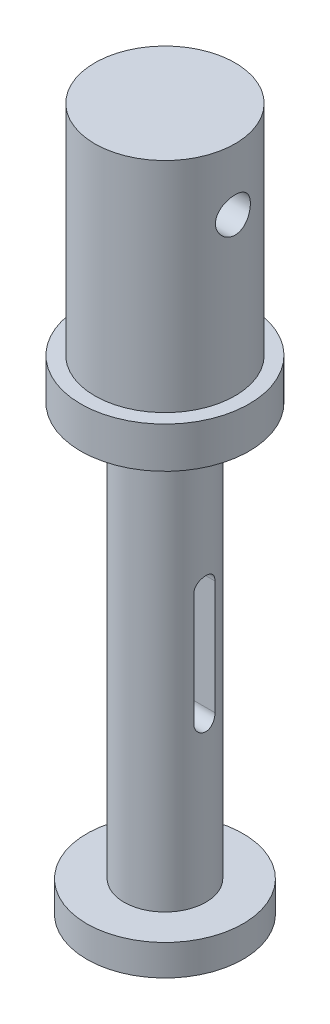
ISO-10303-21;
HEADER;
FILE_DESCRIPTION(('STEP AP214'),'2;1');
FILE_NAME('part.step','',(''),(''),'','','');
FILE_SCHEMA(('AUTOMOTIVE_DESIGN { 1 0 10303 214 1 1 1 1 }'));
ENDSEC;
DATA;
#1=APPLICATION_CONTEXT('core data for automotive mechanical design processes');
#2=APPLICATION_PROTOCOL_DEFINITION('international standard','automotive_design',2000,#1);
#3=PRODUCT_CONTEXT('',#1,'mechanical');
#4=PRODUCT('Part','Part','',(#3));
#5=PRODUCT_RELATED_PRODUCT_CATEGORY('part','',(#4));
#6=PRODUCT_DEFINITION_FORMATION('','',#4);
#7=PRODUCT_DEFINITION_CONTEXT('part definition',#1,'design');
#8=PRODUCT_DEFINITION('design','',#6,#7);
#9=PRODUCT_DEFINITION_SHAPE('','',#8);
#10=(LENGTH_UNIT() NAMED_UNIT(*) SI_UNIT(.MILLI.,.METRE.));
#11=(NAMED_UNIT(*) PLANE_ANGLE_UNIT() SI_UNIT($,.RADIAN.));
#12=(NAMED_UNIT(*) SI_UNIT($,.STERADIAN.) SOLID_ANGLE_UNIT());
#13=UNCERTAINTY_MEASURE_WITH_UNIT(LENGTH_MEASURE(1.E-05),#10,'distance_accuracy_value','');
#14=(GEOMETRIC_REPRESENTATION_CONTEXT(3) GLOBAL_UNCERTAINTY_ASSIGNED_CONTEXT((#13)) GLOBAL_UNIT_ASSIGNED_CONTEXT((#10,
#11,#12)) REPRESENTATION_CONTEXT('',''));
#15=CARTESIAN_POINT('',(0.,0.,0.));
#16=DIRECTION('',(0.,0.,1.));
#17=DIRECTION('',(1.,0.,0.));
#18=AXIS2_PLACEMENT_3D('',#15,#16,#17);
#19=CARTESIAN_POINT('',(0.,123.601449710491,0.));
#20=DIRECTION('',(0.,-1.,0.));
#21=DIRECTION('',(0.,0.,-1.));
#22=AXIS2_PLACEMENT_3D('',#19,#20,#21);
#23=PLANE('',#22);
#24=CARTESIAN_POINT('',(0.,123.601449710491,0.));
#25=DIRECTION('',(0.,1.,0.));
#26=DIRECTION('',(0.,0.,1.));
#27=AXIS2_PLACEMENT_3D('',#24,#25,#26);
#28=CIRCLE('',#27,12.);
#29=CARTESIAN_POINT('',(0.,123.601449710491,12.));
#30=VERTEX_POINT('',#29);
#31=EDGE_CURVE('E190',#30,#30,#28,.T.);
#32=ORIENTED_EDGE('',*,*,#31,.T.);
#33=EDGE_LOOP('',(#32));
#34=FACE_BOUND('',#33,.T.);
#35=ADVANCED_FACE('F41',(#34),#23,.F.);
#36=CARTESIAN_POINT('',(0.,123.601449710491,0.));
#37=DIRECTION('',(0.,1.,0.));
#38=DIRECTION('',(0.,0.,1.));
#39=AXIS2_PLACEMENT_3D('',#36,#37,#38);
#40=CYLINDRICAL_SURFACE('',#39,12.);
#41=CARTESIAN_POINT('',(-11.62231521736,113.066011559405,-2.98693638839584));
#42=CARTESIAN_POINT('',(-11.6223183801697,113.230975977914,-2.98693166113352));
#43=CARTESIAN_POINT('',(-11.6258657665658,113.395992864639,-2.97322370150407));
#44=CARTESIAN_POINT('',(-11.6396361609971,113.721289590537,-2.91884045516726));
#45=CARTESIAN_POINT('',(-11.6498630884159,113.881566590713,-2.87814933521781));
#46=CARTESIAN_POINT('',(-11.6757641628013,114.192631236569,-2.7711969454871));
#47=CARTESIAN_POINT('',(-11.6914313145505,114.343430776011,-2.70496850040691));
#48=CARTESIAN_POINT('',(-11.7264388481365,114.63179457068,-2.54892120584928));
#49=CARTESIAN_POINT('',(-11.7457793775798,114.76935829372,-2.45910140835074));
#50=CARTESIAN_POINT('',(-11.7864267900104,115.030346706336,-2.25632814220211));
#51=CARTESIAN_POINT('',(-11.8077648664083,115.153440084722,-2.14295441461951));
#52=CARTESIAN_POINT('',(-11.849732420939,115.379075489835,-1.8971968326496));
#53=CARTESIAN_POINT('',(-11.8703618331167,115.481615607948,-1.76481121473915));
#54=CARTESIAN_POINT('',(-11.908932604754,115.664587613319,-1.48251983846279));
#55=CARTESIAN_POINT('',(-11.9268328617315,115.744694276849,-1.33239717883652));
#56=CARTESIAN_POINT('',(-11.9575727088027,115.878411194022,-1.02029714033672));
#57=CARTESIAN_POINT('',(-11.9704130388202,115.932025322016,-0.858321498860026));
#58=CARTESIAN_POINT('',(-11.9893657617717,116.010174761936,-0.530567007805157));
#59=CARTESIAN_POINT('',(-11.9956081362523,116.035272627105,-0.364929938946551));
#60=CARTESIAN_POINT('',(-12.0011144589594,116.057442671495,-0.0316866184063519));
#61=CARTESIAN_POINT('',(-12.0003794303137,116.054518959645,0.13591934096827));
#62=CARTESIAN_POINT('',(-11.9921106172837,116.021133973194,0.464441964058615));
#63=CARTESIAN_POINT('',(-11.9847267486261,115.991279888804,0.625424672263459));
#64=CARTESIAN_POINT('',(-11.9641643332798,115.905857279361,0.940019658198392));
#65=CARTESIAN_POINT('',(-11.9509854796373,115.850287392163,1.09363154502619));
#66=CARTESIAN_POINT('',(-11.9200841141147,115.714517658872,1.39072725231274));
#67=CARTESIAN_POINT('',(-11.9023218802186,115.634101211777,1.53410778713243));
#68=CARTESIAN_POINT('',(-11.8641812610908,115.451085290987,1.80555214294636));
#69=CARTESIAN_POINT('',(-11.8438024244944,115.348481987959,1.93361331396632));
#70=CARTESIAN_POINT('',(-11.8020048211808,115.120748018583,2.17440462573014));
#71=CARTESIAN_POINT('',(-11.7805728230533,114.995086728508,2.28663115443474));
#72=CARTESIAN_POINT('',(-11.7395852424359,114.726503407052,2.48853005599463));
#73=CARTESIAN_POINT('',(-11.7200297461162,114.583580583691,2.57820139340809));
#74=CARTESIAN_POINT('',(-11.6849623655475,114.283549816758,2.73276317847063));
#75=CARTESIAN_POINT('',(-11.6694702183602,114.126377449681,2.79753335621964));
#76=CARTESIAN_POINT('',(-11.6445374489584,113.802896180227,2.89957525777056));
#77=CARTESIAN_POINT('',(-11.6350955445705,113.636589221779,2.93685280809036));
#78=CARTESIAN_POINT('',(-11.6236011435797,113.304227502764,2.98201773466639));
#79=CARTESIAN_POINT('',(-11.62136158423,113.138280222652,2.99064931213823));
#80=CARTESIAN_POINT('',(-11.6240164284782,112.807316213818,2.98031384687436));
#81=CARTESIAN_POINT('',(-11.6289101817135,112.64229940164,2.961349320148));
#82=CARTESIAN_POINT('',(-11.6451010889091,112.32063758392,2.89701226193752));
#83=CARTESIAN_POINT('',(-11.6562933127185,112.163900303304,2.85207214961408));
#84=CARTESIAN_POINT('',(-11.6837206409589,111.860183707112,2.73753863026177));
#85=CARTESIAN_POINT('',(-11.6999563387308,111.713205542119,2.66794232241214));
#86=CARTESIAN_POINT('',(-11.7360357417718,111.430023648297,2.5045113304102));
#87=CARTESIAN_POINT('',(-11.7559435260029,111.294085335074,2.41023121116154));
#88=CARTESIAN_POINT('',(-11.7969663615877,111.039685536874,2.20067280271578));
#89=CARTESIAN_POINT('',(-11.8180816091541,110.921226903602,2.0853910940746));
#90=CARTESIAN_POINT('',(-11.8597735516274,110.702139084867,1.83368828307186));
#91=CARTESIAN_POINT('',(-11.8803239358858,110.602024445422,1.69681413965957));
#92=CARTESIAN_POINT('',(-11.9180287495337,110.42620141213,1.40776465140332));
#93=CARTESIAN_POINT('',(-11.9351833556265,110.35049174821,1.25559010335636));
#94=CARTESIAN_POINT('',(-11.9640558964643,110.226282257308,0.941308814987651));
#95=CARTESIAN_POINT('',(-11.9758126974928,110.177587366222,0.779282906477346));
#96=CARTESIAN_POINT('',(-11.9927350310732,110.108203105836,0.449016649022797));
#97=CARTESIAN_POINT('',(-11.9979018238669,110.087508381872,0.280777494604103));
#98=CARTESIAN_POINT('',(-12.0010110594382,110.075010913081,-0.0523038423029869));
#99=CARTESIAN_POINT('',(-11.9991434600062,110.082448502218,-0.217116182064397));
#100=CARTESIAN_POINT('',(-11.988814471731,110.124266043411,-0.543064234666987));
#101=CARTESIAN_POINT('',(-11.9803532758811,110.158645206891,-0.704200054977051));
#102=CARTESIAN_POINT('',(-11.9578166298721,110.252964060413,-1.01743347128051));
#103=CARTESIAN_POINT('',(-11.9437711400986,110.312767463201,-1.16957440135236));
#104=CARTESIAN_POINT('',(-11.9115456613929,110.456113326475,-1.46174851933929));
#105=CARTESIAN_POINT('',(-11.8933651553181,110.539658756565,-1.60178018979349));
#106=CARTESIAN_POINT('',(-11.8542905190918,110.730439865792,-1.86936674640294));
#107=CARTESIAN_POINT('',(-11.8333421379864,110.838191674687,-1.99654572931224));
#108=CARTESIAN_POINT('',(-11.7913384473141,111.073323335266,-2.23127489828467));
#109=CARTESIAN_POINT('',(-11.7702831120398,111.200708145016,-2.33882011105886));
#110=CARTESIAN_POINT('',(-11.7300075169742,111.474319059691,-2.53317584492631));
#111=CARTESIAN_POINT('',(-11.7108282841015,111.620849437869,-2.61956717877612));
#112=CARTESIAN_POINT('',(-11.6770270952704,111.926810061673,-2.76636084615461));
#113=CARTESIAN_POINT('',(-11.6624018051404,112.086230761405,-2.82678220600074));
#114=CARTESIAN_POINT('',(-11.6416659101657,112.382159219783,-2.91085841664844));
#115=CARTESIAN_POINT('',(-11.634463762181,112.517243247058,-2.9393257539321));
#116=CARTESIAN_POINT('',(-11.6247872914603,112.790209967961,-2.9773659253434));
#117=CARTESIAN_POINT('',(-11.6223125730808,112.928092426409,-2.98694034064159));
#118=CARTESIAN_POINT('',(-11.62231521736,113.066011559405,-2.98693638839584));
#119=B_SPLINE_CURVE_WITH_KNOTS('',3,(#41,#42,#43,#44,#45,#46,#47,#48,#49,#50,#51,#52,#53,#54,
#55,#56,#57,#58,#59,#60,#61,#62,#63,#64,#65,#66,#67,#68,#69,#70,#71,#72,#73,#74,#75,#76,#77,#78,
#79,#80,#81,#82,#83,#84,#85,#86,#87,#88,#89,#90,#91,#92,#93,#94,#95,#96,#97,#98,#99,#100,#101,
#102,#103,#104,#105,#106,#107,#108,#109,#110,#111,#112,#113,#114,#115,#116,#117,#118),
.UNSPECIFIED.,.T.,.F.,(4,2,2,2,2,2,2,2,2,2,2,2,2,2,2,2,2,2,2,2,2,2,2,2,2,2,2,2,2,2,2,2,2,2,2,2,
2,2,4),(0.,0.494386812595482,0.989063979649592,1.48310741580161,1.9771707081819,
2.48095151216705,2.98477907655468,3.49557163041248,4.00628946226399,4.50674699328419,
5.00713114111596,5.49650776458021,5.98591031290087,6.47970573182357,6.97358644532842,
7.48072010939277,7.9878770502102,8.49745361970974,9.00692216349027,9.50304694941866,
9.99912650518059,10.4871763200128,10.9752835733676,11.4728919292681,11.9705813774673,
12.480603422528,12.9905989209861,13.4968623308568,14.0030289107953,14.4956261312873,
14.9882089341016,15.4781838838619,15.9682201456788,16.469909957104,16.9717266721743,
17.4828023834723,17.993503025766,18.4068716079686,18.8202055934075),.UNSPECIFIED.);
#120=CARTESIAN_POINT('',(-11.62231521736,113.066011559405,-2.98693638839584));
#121=VERTEX_POINT('',#120);
#122=EDGE_CURVE('E155',#121,#121,#119,.T.);
#123=ORIENTED_EDGE('',*,*,#122,.T.);
#124=EDGE_LOOP('',(#123));
#125=FACE_BOUND('',#124,.T.);
#126=CARTESIAN_POINT('',(11.62231521736,113.066011559405,-2.98693638839584));
#127=CARTESIAN_POINT('',(11.6223183801697,112.901047140896,-2.98693166113352));
#128=CARTESIAN_POINT('',(11.6258657665658,112.736030254171,-2.97322370150407));
#129=CARTESIAN_POINT('',(11.6396361609971,112.410733528273,-2.91884045516726));
#130=CARTESIAN_POINT('',(11.6498630884159,112.250456528096,-2.87814933521781));
#131=CARTESIAN_POINT('',(11.6757641628013,111.93939188224,-2.7711969454871));
#132=CARTESIAN_POINT('',(11.6914313145505,111.788592342798,-2.70496850040691));
#133=CARTESIAN_POINT('',(11.7264388481365,111.500228548129,-2.54892120584928));
#134=CARTESIAN_POINT('',(11.7457793775798,111.362664825089,-2.45910140835074));
#135=CARTESIAN_POINT('',(11.7864267900104,111.101676412474,-2.25632814220211));
#136=CARTESIAN_POINT('',(11.8077648664083,110.978583034088,-2.14295441461951));
#137=CARTESIAN_POINT('',(11.849732420939,110.752947628974,-1.8971968326496));
#138=CARTESIAN_POINT('',(11.8703618331167,110.650407510861,-1.76481121473915));
#139=CARTESIAN_POINT('',(11.908932604754,110.467435505491,-1.48251983846279));
#140=CARTESIAN_POINT('',(11.9268328617315,110.387328841961,-1.33239717883652));
#141=CARTESIAN_POINT('',(11.9575727088027,110.253611924787,-1.02029714033672));
#142=CARTESIAN_POINT('',(11.9704130388202,110.199997796793,-0.858321498860026));
#143=CARTESIAN_POINT('',(11.9893657617717,110.121848356873,-0.530567007805157));
#144=CARTESIAN_POINT('',(11.9956081362523,110.096750491704,-0.364929938946551));
#145=CARTESIAN_POINT('',(12.0011144589594,110.074580447314,-0.0316866184063515));
#146=CARTESIAN_POINT('',(12.0003794303137,110.077504159164,0.13591934096827));
#147=CARTESIAN_POINT('',(11.9921106172837,110.110889145615,0.464441964058616));
#148=CARTESIAN_POINT('',(11.9847267486261,110.140743230006,0.62542467226346));
#149=CARTESIAN_POINT('',(11.9641643332798,110.226165839449,0.940019658198393));
#150=CARTESIAN_POINT('',(11.9509854796373,110.281735726646,1.0936315450262));
#151=CARTESIAN_POINT('',(11.9200841141147,110.417505459937,1.39072725231274));
#152=CARTESIAN_POINT('',(11.9023218802186,110.497921907033,1.53410778713244));
#153=CARTESIAN_POINT('',(11.8641812610908,110.680937827823,1.80555214294636));
#154=CARTESIAN_POINT('',(11.8438024244944,110.78354113085,1.93361331396631));
#155=CARTESIAN_POINT('',(11.8020048211808,111.011275100226,2.17440462573015));
#156=CARTESIAN_POINT('',(11.7805728230533,111.136936390302,2.28663115443474));
#157=CARTESIAN_POINT('',(11.7395852424359,111.405519711758,2.48853005599464));
#158=CARTESIAN_POINT('',(11.7200297461162,111.548442535118,2.57820139340809));
#159=CARTESIAN_POINT('',(11.6849623655475,111.848473302052,2.73276317847063));
#160=CARTESIAN_POINT('',(11.6694702183602,112.005645669129,2.79753335621964));
#161=CARTESIAN_POINT('',(11.6445374489584,112.329126938582,2.89957525777056));
#162=CARTESIAN_POINT('',(11.6350955445705,112.495433897031,2.93685280809036));
#163=CARTESIAN_POINT('',(11.6236011435797,112.827795616045,2.98201773466639));
#164=CARTESIAN_POINT('',(11.62136158423,112.993742896157,2.99064931213823));
#165=CARTESIAN_POINT('',(11.6240164284782,113.324706904991,2.98031384687436));
#166=CARTESIAN_POINT('',(11.6289101817135,113.489723717169,2.961349320148));
#167=CARTESIAN_POINT('',(11.6451010889091,113.811385534889,2.89701226193752));
#168=CARTESIAN_POINT('',(11.6562933127185,113.968122815505,2.85207214961408));
#169=CARTESIAN_POINT('',(11.6837206409589,114.271839411698,2.73753863026177));
#170=CARTESIAN_POINT('',(11.6999563387308,114.41881757669,2.66794232241214));
#171=CARTESIAN_POINT('',(11.7360357417718,114.701999470513,2.5045113304102));
#172=CARTESIAN_POINT('',(11.7559435260029,114.837937783736,2.41023121116155));
#173=CARTESIAN_POINT('',(11.7969663615877,115.092337581936,2.20067280271579));
#174=CARTESIAN_POINT('',(11.8180816091541,115.210796215207,2.0853910940746));
#175=CARTESIAN_POINT('',(11.8597735516274,115.429884033943,1.83368828307186));
#176=CARTESIAN_POINT('',(11.8803239358858,115.529998673387,1.69681413965958));
#177=CARTESIAN_POINT('',(11.9180287495337,115.70582170668,1.40776465140332));
#178=CARTESIAN_POINT('',(11.9351833556265,115.781531370599,1.25559010335637));
#179=CARTESIAN_POINT('',(11.9640558964643,115.905740861501,0.941308814987652));
#180=CARTESIAN_POINT('',(11.9758126974928,115.954435752588,0.779282906477346));
#181=CARTESIAN_POINT('',(11.9927350310732,116.023820012974,0.449016649022797));
#182=CARTESIAN_POINT('',(11.9979018238669,116.044514736938,0.280777494604104));
#183=CARTESIAN_POINT('',(12.0010110594382,116.057012205729,-0.0523038423029864));
#184=CARTESIAN_POINT('',(11.9991434600062,116.049574616591,-0.217116182064396));
#185=CARTESIAN_POINT('',(11.988814471731,116.007757075399,-0.543064234666987));
#186=CARTESIAN_POINT('',(11.9803532758811,115.973377911918,-0.704200054977051));
#187=CARTESIAN_POINT('',(11.9578166298721,115.879059058397,-1.01743347128051));
#188=CARTESIAN_POINT('',(11.9437711400986,115.819255655608,-1.16957440135236));
#189=CARTESIAN_POINT('',(11.9115456613929,115.675909792334,-1.46174851933929));
#190=CARTESIAN_POINT('',(11.8933651553181,115.592364362245,-1.60178018979349));
#191=CARTESIAN_POINT('',(11.8542905190918,115.401583253017,-1.86936674640294));
#192=CARTESIAN_POINT('',(11.8333421379864,115.293831444122,-1.99654572931223));
#193=CARTESIAN_POINT('',(11.7913384473141,115.058699783543,-2.23127489828466));
#194=CARTESIAN_POINT('',(11.7702831120398,114.931314973794,-2.33882011105885));
#195=CARTESIAN_POINT('',(11.7300075169742,114.657704059119,-2.53317584492631));
#196=CARTESIAN_POINT('',(11.7108282841015,114.51117368094,-2.61956717877612));
#197=CARTESIAN_POINT('',(11.6770270952704,114.205213057137,-2.76636084615462));
#198=CARTESIAN_POINT('',(11.6624018051404,114.045792357404,-2.82678220600074));
#199=CARTESIAN_POINT('',(11.6416659101657,113.749863899027,-2.91085841664844));
#200=CARTESIAN_POINT('',(11.634463762181,113.614779871751,-2.9393257539321));
#201=CARTESIAN_POINT('',(11.6247872914603,113.341813150848,-2.9773659253434));
#202=CARTESIAN_POINT('',(11.6223125730808,113.203930692401,-2.98694034064159));
#203=CARTESIAN_POINT('',(11.62231521736,113.066011559405,-2.98693638839584));
#204=B_SPLINE_CURVE_WITH_KNOTS('',3,(#126,#127,#128,#129,#130,#131,#132,#133,#134,#135,#136,
#137,#138,#139,#140,#141,#142,#143,#144,#145,#146,#147,#148,#149,#150,#151,#152,#153,#154,#155,
#156,#157,#158,#159,#160,#161,#162,#163,#164,#165,#166,#167,#168,#169,#170,#171,#172,#173,#174,
#175,#176,#177,#178,#179,#180,#181,#182,#183,#184,#185,#186,#187,#188,#189,#190,#191,#192,#193,
#194,#195,#196,#197,#198,#199,#200,#201,#202,#203),.UNSPECIFIED.,.T.,.F.,(4,2,2,2,2,2,2,2,2,2,2,
2,2,2,2,2,2,2,2,2,2,2,2,2,2,2,2,2,2,2,2,2,2,2,2,2,2,2,4),(0.,0.494386812595482,
0.989063979649592,1.48310741580161,1.9771707081819,2.48095151216706,2.98477907655468,
3.49557163041248,4.00628946226399,4.50674699328419,5.00713114111596,5.49650776458022,
5.98591031290087,6.47970573182358,6.97358644532843,7.48072010939278,7.9878770502102,
8.49745361970974,9.00692216349027,9.50304694941866,9.99912650518059,10.4871763200128,
10.9752835733676,11.4728919292681,11.9705813774673,12.480603422528,12.9905989209861,
13.4968623308568,14.0030289107953,14.4956261312873,14.9882089341016,15.4781838838619,
15.9682201456788,16.469909957104,16.9717266721743,17.4828023834723,17.993503025766,
18.4068716079686,18.8202055934075),.UNSPECIFIED.);
#205=CARTESIAN_POINT('',(11.62231521736,113.066011559405,-2.98693638839584));
#206=VERTEX_POINT('',#205);
#207=EDGE_CURVE('E150',#206,#206,#204,.T.);
#208=ORIENTED_EDGE('',*,*,#207,.T.);
#209=EDGE_LOOP('',(#208));
#210=FACE_BOUND('',#209,.T.);
#211=ORIENTED_EDGE('',*,*,#31,.F.);
#212=EDGE_LOOP('',(#211));
#213=FACE_BOUND('',#212,.T.);
#214=CARTESIAN_POINT('',(0.,86.2616214612922,0.));
#215=DIRECTION('',(0.,1.,0.));
#216=DIRECTION('',(0.,0.,1.));
#217=AXIS2_PLACEMENT_3D('',#214,#215,#216);
#218=CIRCLE('',#217,12.);
#219=CARTESIAN_POINT('',(0.,86.2616214612922,12.));
#220=VERTEX_POINT('',#219);
#221=EDGE_CURVE('E192',#220,#220,#218,.T.);
#222=ORIENTED_EDGE('',*,*,#221,.T.);
#223=EDGE_LOOP('',(#222));
#224=FACE_BOUND('',#223,.T.);
#225=ADVANCED_FACE('F161',(#125,#210,#213,#224),#40,.T.);
#226=CARTESIAN_POINT('',(0.,86.2616214612921,-12.));
#227=DIRECTION('',(0.,-1.,0.));
#228=DIRECTION('',(0.,0.,-1.));
#229=AXIS2_PLACEMENT_3D('',#226,#227,#228);
#230=PLANE('',#229);
#231=ORIENTED_EDGE('',*,*,#221,.F.);
#232=EDGE_LOOP('',(#231));
#233=FACE_BOUND('',#232,.T.);
#234=CARTESIAN_POINT('',(0.,86.2616214612921,0.));
#235=DIRECTION('',(0.,1.,0.));
#236=DIRECTION('',(0.,0.,1.));
#237=AXIS2_PLACEMENT_3D('',#234,#235,#236);
#238=CIRCLE('',#237,14.3984122525992);
#239=CARTESIAN_POINT('',(0.,86.2616214612921,14.3984122525992));
#240=VERTEX_POINT('',#239);
#241=EDGE_CURVE('E194',#240,#240,#238,.T.);
#242=ORIENTED_EDGE('',*,*,#241,.T.);
#243=EDGE_LOOP('',(#242));
#244=FACE_BOUND('',#243,.T.);
#245=ADVANCED_FACE('F165',(#233,#244),#230,.F.);
#246=CARTESIAN_POINT('',(0.,123.601449710491,0.));
#247=DIRECTION('',(0.,1.,0.));
#248=DIRECTION('',(0.,0.,1.));
#249=AXIS2_PLACEMENT_3D('',#246,#247,#248);
#250=CYLINDRICAL_SURFACE('',#249,14.3984122525992);
#251=ORIENTED_EDGE('',*,*,#241,.F.);
#252=EDGE_LOOP('',(#251));
#253=FACE_BOUND('',#252,.T.);
#254=CARTESIAN_POINT('',(0.,79.2616214612922,0.));
#255=DIRECTION('',(0.,1.,0.));
#256=DIRECTION('',(0.,0.,1.));
#257=AXIS2_PLACEMENT_3D('',#254,#255,#256);
#258=CIRCLE('',#257,14.3984122525992);
#259=CARTESIAN_POINT('',(0.,79.2616214612922,14.3984122525992));
#260=VERTEX_POINT('',#259);
#261=EDGE_CURVE('E199',#260,#260,#258,.T.);
#262=ORIENTED_EDGE('',*,*,#261,.T.);
#263=EDGE_LOOP('',(#262));
#264=FACE_BOUND('',#263,.T.);
#265=ADVANCED_FACE('F170',(#253,#264),#250,.T.);
#266=CARTESIAN_POINT('',(0.,79.2616214612921,-6.99148112304805));
#267=DIRECTION('',(0.,1.,0.));
#268=DIRECTION('',(0.,0.,1.));
#269=AXIS2_PLACEMENT_3D('',#266,#267,#268);
#270=PLANE('',#269);
#271=ORIENTED_EDGE('',*,*,#261,.F.);
#272=EDGE_LOOP('',(#271));
#273=FACE_BOUND('',#272,.T.);
#274=CARTESIAN_POINT('',(0.,79.2616214612921,0.));
#275=DIRECTION('',(0.,1.,0.));
#276=DIRECTION('',(0.,0.,1.));
#277=AXIS2_PLACEMENT_3D('',#274,#275,#276);
#278=CIRCLE('',#277,6.99148112304804);
#279=CARTESIAN_POINT('',(0.,79.2616214612921,6.99148112304804));
#280=VERTEX_POINT('',#279);
#281=EDGE_CURVE('E202',#280,#280,#278,.T.);
#282=ORIENTED_EDGE('',*,*,#281,.T.);
#283=EDGE_LOOP('',(#282));
#284=FACE_BOUND('',#283,.T.);
#285=ADVANCED_FACE('F173',(#273,#284),#270,.F.);
#286=CARTESIAN_POINT('',(0.,123.601449710491,0.));
#287=DIRECTION('',(0.,1.,0.));
#288=DIRECTION('',(0.,0.,1.));
#289=AXIS2_PLACEMENT_3D('',#286,#287,#288);
#290=CYLINDRICAL_SURFACE('',#289,6.99148112304804);
#291=DIRECTION('',(0.,1.,0.));
#292=VECTOR('',#291,1.);
#293=CARTESIAN_POINT('',(6.75579812412546,123.601449710491,1.80000000000001));
#294=LINE('',#293,#292);
#295=CARTESIAN_POINT('',(6.75579812412545,35.8157884100073,1.8));
#296=VERTEX_POINT('',#295);
#297=CARTESIAN_POINT('',(6.75579812412546,55.3255499965933,1.8));
#298=VERTEX_POINT('',#297);
#299=EDGE_CURVE('E84',#296,#298,#294,.T.);
#300=ORIENTED_EDGE('',*,*,#299,.T.);
#301=CARTESIAN_POINT('',(6.75579812412546,55.3255499965933,1.8));
#302=CARTESIAN_POINT('',(6.75579465223751,55.3752915317262,1.80000066475597));
#303=CARTESIAN_POINT('',(6.75634817726223,55.4250083653446,1.79793683467152));
#304=CARTESIAN_POINT('',(6.75853339092846,55.5240691762918,1.78970994003612));
#305=CARTESIAN_POINT('',(6.76016488990851,55.5734132176661,1.78354759658672));
#306=CARTESIAN_POINT('',(6.76661028366605,55.7201397336168,1.75900444487241));
#307=CARTESIAN_POINT('',(6.77297549226203,55.8165122807149,1.73456710400741));
#308=CARTESIAN_POINT('',(6.78909825985746,56.003609215281,1.67033946178667));
#309=CARTESIAN_POINT('',(6.79885538199036,56.0943343283453,1.63055113751126));
#310=CARTESIAN_POINT('',(6.82065679321254,56.2678701964447,1.5368012711769));
#311=CARTESIAN_POINT('',(6.83270175793241,56.3506786026829,1.48283554053162));
#312=CARTESIAN_POINT('',(6.85803298576623,56.507905870848,1.36093248317618));
#313=CARTESIAN_POINT('',(6.87133992920604,56.5821132430406,1.29272674589587));
#314=CARTESIAN_POINT('',(6.89751790580934,56.7181777411845,1.1448513745644));
#315=CARTESIAN_POINT('',(6.91038886855768,56.7800328799524,1.06517989948772));
#316=CARTESIAN_POINT('',(6.93447495292805,56.8905077831596,0.895172158566369));
#317=CARTESIAN_POINT('',(6.94566264683084,56.9389173607929,0.804695089354983));
#318=CARTESIAN_POINT('',(6.96488301089709,57.0197568662734,0.616555307042727));
#319=CARTESIAN_POINT('',(6.97291632817667,57.0521900719996,0.518894072649977));
#320=CARTESIAN_POINT('',(6.98477645459233,57.0994748407784,0.321373788031119));
#321=CARTESIAN_POINT('',(6.98868965707985,57.1146880201288,0.221606583557543));
#322=CARTESIAN_POINT('',(6.9921701896188,57.1282372578362,0.0208622278241791));
#323=CARTESIAN_POINT('',(6.99173810403097,57.1265755855479,-0.0801147589180967));
#324=CARTESIAN_POINT('',(6.98664044030444,57.1066793238658,-0.277895852858275));
#325=CARTESIAN_POINT('',(6.98207470786089,57.0888355854125,-0.374742241938637));
#326=CARTESIAN_POINT('',(6.96933977393503,57.0377115539425,-0.564016051964715));
#327=CARTESIAN_POINT('',(6.96117040773468,57.0044305553024,-0.656443270701063));
#328=CARTESIAN_POINT('',(6.94199531781239,56.9230674652778,-0.83527280573364));
#329=CARTESIAN_POINT('',(6.93096350143285,56.8748483772301,-0.921609878746297));
#330=CARTESIAN_POINT('',(6.90725701655675,56.7650831473747,-1.08510038382327));
#331=CARTESIAN_POINT('',(6.89458208300257,56.7035348543046,-1.16225233033871));
#332=CARTESIAN_POINT('',(6.86853962304815,56.5667804800597,-1.30750855837715));
#333=CARTESIAN_POINT('',(6.85516265490853,56.4912345023478,-1.37529146343653));
#334=CARTESIAN_POINT('',(6.82954988269832,56.3296866934728,-1.49731640187323));
#335=CARTESIAN_POINT('',(6.81731439273287,56.2436819992519,-1.55155471497506));
#336=CARTESIAN_POINT('',(6.79533166468855,56.062984282681,-1.64517809861954));
#337=CARTESIAN_POINT('',(6.78559963455942,55.9682426977994,-1.6844730505908));
#338=CARTESIAN_POINT('',(6.76992212878296,55.7732412847546,-1.74642520565137));
#339=CARTESIAN_POINT('',(6.76397098339734,55.6729899653543,-1.76910732884709));
#340=CARTESIAN_POINT('',(6.75879122097401,55.5308085546176,-1.7887349835139));
#341=CARTESIAN_POINT('',(6.75767063780914,55.4898452145,-1.79295994635494));
#342=CARTESIAN_POINT('',(6.75617436706349,55.4077777988996,-1.79858935963434));
#343=CARTESIAN_POINT('',(6.75579748540338,55.3666740553371,-1.79999833144514));
#344=CARTESIAN_POINT('',(6.75579812412546,55.3255499965933,-1.8));
#345=B_SPLINE_CURVE_WITH_KNOTS('',3,(#301,#302,#303,#304,#305,#306,#307,#308,#309,#310,#311,
#312,#313,#314,#315,#316,#317,#318,#319,#320,#321,#322,#323,#324,#325,#326,#327,#328,#329,#330,
#331,#332,#333,#334,#335,#336,#337,#338,#339,#340,#341,#342,#343,#344),.UNSPECIFIED.,.F.,.F.,(4,
2,2,2,2,2,2,2,2,2,2,2,2,2,2,2,2,2,2,2,2,4),(0.,0.149130166823407,0.298234102292627,
0.595566532139844,0.892860680793426,1.19024276128026,1.49383954302066,1.79748512705682,
2.10563986911622,2.41373136057456,2.71522546545192,3.01667902550152,3.31103992282236,
3.60541427644233,3.90257251192043,4.19977874293736,4.50547416346649,4.81125345683503,
5.11884861725992,5.42598141863451,5.54948585603115,5.67279183412738),.UNSPECIFIED.);
#346=CARTESIAN_POINT('',(6.75579812412545,55.3255499965933,-1.8));
#347=VERTEX_POINT('',#346);
#348=EDGE_CURVE('E11',#298,#347,#345,.T.);
#349=ORIENTED_EDGE('',*,*,#348,.T.);
#350=DIRECTION('',(0.,1.,0.));
#351=VECTOR('',#350,1.);
#352=CARTESIAN_POINT('',(6.75579812412546,123.601449710491,-1.79999999999999));
#353=LINE('',#352,#351);
#354=CARTESIAN_POINT('',(6.75579812412546,35.8157884100073,-1.8));
#355=VERTEX_POINT('',#354);
#356=EDGE_CURVE('E54',#347,#355,#353,.F.);
#357=ORIENTED_EDGE('',*,*,#356,.T.);
#358=CARTESIAN_POINT('',(6.75579812412546,35.8157884100073,-1.8));
#359=CARTESIAN_POINT('',(6.75579465223751,35.7660468748744,-1.80000066475597));
#360=CARTESIAN_POINT('',(6.75634817726223,35.716330041256,-1.79793683467152));
#361=CARTESIAN_POINT('',(6.75853339092847,35.6172692303089,-1.78970994003612));
#362=CARTESIAN_POINT('',(6.76016488990852,35.5679251889345,-1.78354759658672));
#363=CARTESIAN_POINT('',(6.76661028366605,35.4211986729838,-1.75900444487241));
#364=CARTESIAN_POINT('',(6.77297549226203,35.3248261258857,-1.73456710400741));
#365=CARTESIAN_POINT('',(6.78909825985746,35.1377291913196,-1.67033946178667));
#366=CARTESIAN_POINT('',(6.79885538199036,35.0470040782553,-1.63055113751126));
#367=CARTESIAN_POINT('',(6.82065679321254,34.8734682101559,-1.53680127117691));
#368=CARTESIAN_POINT('',(6.83270175793241,34.7906598039177,-1.48283554053162));
#369=CARTESIAN_POINT('',(6.85803298576623,34.6334325357526,-1.36093248317618));
#370=CARTESIAN_POINT('',(6.87133992920604,34.5592251635601,-1.29272674589587));
#371=CARTESIAN_POINT('',(6.89751790580934,34.4231606654161,-1.1448513745644));
#372=CARTESIAN_POINT('',(6.91038886855768,34.3613055266483,-1.06517989948773));
#373=CARTESIAN_POINT('',(6.93447495292806,34.2508306234411,-0.89517215856637));
#374=CARTESIAN_POINT('',(6.94566264683085,34.2024210458077,-0.804695089354984));
#375=CARTESIAN_POINT('',(6.96488301089709,34.1215815403273,-0.616555307042728));
#376=CARTESIAN_POINT('',(6.97291632817667,34.0891483346011,-0.518894072649978));
#377=CARTESIAN_POINT('',(6.98477645459233,34.0418635658222,-0.321373788031119));
#378=CARTESIAN_POINT('',(6.98868965707985,34.0266503864719,-0.221606583557544));
#379=CARTESIAN_POINT('',(6.9921701896188,34.0131011487644,-0.020862227824179));
#380=CARTESIAN_POINT('',(6.99173810403097,34.0147628210528,0.080114758918097));
#381=CARTESIAN_POINT('',(6.98664044030443,34.0346590827348,0.277895852858275));
#382=CARTESIAN_POINT('',(6.98207470786089,34.0525028211881,0.374742241938638));
#383=CARTESIAN_POINT('',(6.96933977393503,34.1036268526582,0.564016051964715));
#384=CARTESIAN_POINT('',(6.96117040773468,34.1369078512983,0.656443270701063));
#385=CARTESIAN_POINT('',(6.94199531781239,34.2182709413228,0.83527280573364));
#386=CARTESIAN_POINT('',(6.93096350143285,34.2664900293706,0.921609878746298));
#387=CARTESIAN_POINT('',(6.90725701655674,34.376255259226,1.08510038382327));
#388=CARTESIAN_POINT('',(6.89458208300257,34.4378035522961,1.16225233033871));
#389=CARTESIAN_POINT('',(6.86853962304815,34.574557926541,1.30750855837714));
#390=CARTESIAN_POINT('',(6.85516265490853,34.6501039042529,1.37529146343653));
#391=CARTESIAN_POINT('',(6.82954988269832,34.8116517131279,1.49731640187322));
#392=CARTESIAN_POINT('',(6.81731439273286,34.8976564073488,1.55155471497506));
#393=CARTESIAN_POINT('',(6.79533166468855,35.0783541239197,1.64517809861954));
#394=CARTESIAN_POINT('',(6.78559963455942,35.1730957088013,1.6844730505908));
#395=CARTESIAN_POINT('',(6.76992212878296,35.3680971218461,1.74642520565137));
#396=CARTESIAN_POINT('',(6.76397098339734,35.4683484412464,1.76910732884709));
#397=CARTESIAN_POINT('',(6.758791220974,35.6105298519831,1.7887349835139));
#398=CARTESIAN_POINT('',(6.75767063780913,35.6514931921007,1.79295994635494));
#399=CARTESIAN_POINT('',(6.75617436706349,35.733560607701,1.79858935963434));
#400=CARTESIAN_POINT('',(6.75579748540337,35.7746643512635,1.79999833144514));
#401=CARTESIAN_POINT('',(6.75579812412546,35.8157884100073,1.8));
#402=B_SPLINE_CURVE_WITH_KNOTS('',3,(#358,#359,#360,#361,#362,#363,#364,#365,#366,#367,#368,
#369,#370,#371,#372,#373,#374,#375,#376,#377,#378,#379,#380,#381,#382,#383,#384,#385,#386,#387,
#388,#389,#390,#391,#392,#393,#394,#395,#396,#397,#398,#399,#400,#401),.UNSPECIFIED.,.F.,.F.,(4,
2,2,2,2,2,2,2,2,2,2,2,2,2,2,2,2,2,2,2,2,4),(0.,0.149130166823407,0.298234102292627,
0.595566532139844,0.892860680793426,1.19024276128026,1.49383954302065,1.79748512705682,
2.10563986911622,2.41373136057456,2.71522546545192,3.01667902550152,3.31103992282236,
3.60541427644233,3.90257251192043,4.19977874293736,4.50547416346649,4.81125345683503,
5.11884861725992,5.42598141863451,5.54948585603115,5.67279183412738),.UNSPECIFIED.);
#403=EDGE_CURVE('E88',#355,#296,#402,.T.);
#404=ORIENTED_EDGE('',*,*,#403,.T.);
#405=EDGE_LOOP('',(#300,#349,#357,#404));
#406=FACE_BOUND('',#405,.T.);
#407=DIRECTION('',(0.,1.,0.));
#408=VECTOR('',#407,1.);
#409=CARTESIAN_POINT('',(-6.75579812412546,123.601449710491,-1.79999999999999));
#410=LINE('',#409,#408);
#411=CARTESIAN_POINT('',(-6.75579812412546,35.8157884100073,-1.8));
#412=VERTEX_POINT('',#411);
#413=CARTESIAN_POINT('',(-6.75579812412546,55.3255499965933,-1.8));
#414=VERTEX_POINT('',#413);
#415=EDGE_CURVE('E126',#412,#414,#410,.T.);
#416=ORIENTED_EDGE('',*,*,#415,.T.);
#417=CARTESIAN_POINT('',(-6.75579812412546,55.3255499965933,-1.8));
#418=CARTESIAN_POINT('',(-6.75579465223751,55.3752915317262,-1.80000066475597));
#419=CARTESIAN_POINT('',(-6.75634817726223,55.4250083653446,-1.79793683467152));
#420=CARTESIAN_POINT('',(-6.75853339092847,55.5240691762918,-1.78970994003612));
#421=CARTESIAN_POINT('',(-6.76016488990852,55.5734132176661,-1.78354759658672));
#422=CARTESIAN_POINT('',(-6.76661028366605,55.7201397336168,-1.75900444487241));
#423=CARTESIAN_POINT('',(-6.77297549226203,55.8165122807149,-1.73456710400741));
#424=CARTESIAN_POINT('',(-6.78909825985746,56.003609215281,-1.67033946178667));
#425=CARTESIAN_POINT('',(-6.79885538199036,56.0943343283453,-1.63055113751126));
#426=CARTESIAN_POINT('',(-6.82065679321254,56.2678701964447,-1.5368012711769));
#427=CARTESIAN_POINT('',(-6.83270175793241,56.3506786026829,-1.48283554053162));
#428=CARTESIAN_POINT('',(-6.85803298576623,56.507905870848,-1.36093248317618));
#429=CARTESIAN_POINT('',(-6.87133992920604,56.5821132430406,-1.29272674589587));
#430=CARTESIAN_POINT('',(-6.89751790580934,56.7181777411845,-1.1448513745644));
#431=CARTESIAN_POINT('',(-6.91038886855768,56.7800328799524,-1.06517989948772));
#432=CARTESIAN_POINT('',(-6.93447495292806,56.8905077831596,-0.895172158566369));
#433=CARTESIAN_POINT('',(-6.94566264683085,56.9389173607929,-0.804695089354983));
#434=CARTESIAN_POINT('',(-6.96488301089709,57.0197568662734,-0.616555307042727));
#435=CARTESIAN_POINT('',(-6.97291632817667,57.0521900719996,-0.518894072649977));
#436=CARTESIAN_POINT('',(-6.98477645459233,57.0994748407784,-0.321373788031118));
#437=CARTESIAN_POINT('',(-6.98868965707985,57.1146880201288,-0.221606583557542));
#438=CARTESIAN_POINT('',(-6.9921701896188,57.1282372578362,-0.0208622278241781));
#439=CARTESIAN_POINT('',(-6.99173810403097,57.1265755855479,0.0801147589180978));
#440=CARTESIAN_POINT('',(-6.98664044030443,57.1066793238658,0.277895852858276));
#441=CARTESIAN_POINT('',(-6.98207470786089,57.0888355854125,0.374742241938638));
#442=CARTESIAN_POINT('',(-6.96933977393503,57.0377115539425,0.564016051964715));
#443=CARTESIAN_POINT('',(-6.96117040773468,57.0044305553024,0.656443270701063));
#444=CARTESIAN_POINT('',(-6.94199531781239,56.9230674652778,0.83527280573364));
#445=CARTESIAN_POINT('',(-6.93096350143285,56.8748483772301,0.921609878746298));
#446=CARTESIAN_POINT('',(-6.90725701655674,56.7650831473747,1.08510038382327));
#447=CARTESIAN_POINT('',(-6.89458208300257,56.7035348543046,1.16225233033871));
#448=CARTESIAN_POINT('',(-6.86853962304815,56.5667804800597,1.30750855837714));
#449=CARTESIAN_POINT('',(-6.85516265490853,56.4912345023478,1.37529146343653));
#450=CARTESIAN_POINT('',(-6.82954988269832,56.3296866934728,1.49731640187322));
#451=CARTESIAN_POINT('',(-6.81731439273286,56.2436819992519,1.55155471497506));
#452=CARTESIAN_POINT('',(-6.79533166468855,56.062984282681,1.64517809861953));
#453=CARTESIAN_POINT('',(-6.78559963455942,55.9682426977994,1.6844730505908));
#454=CARTESIAN_POINT('',(-6.76992212878296,55.7732412847546,1.74642520565137));
#455=CARTESIAN_POINT('',(-6.76397098339734,55.6729899653543,1.76910732884709));
#456=CARTESIAN_POINT('',(-6.758791220974,55.5308085546176,1.78873498351389));
#457=CARTESIAN_POINT('',(-6.75767063780913,55.4898452145,1.79295994635494));
#458=CARTESIAN_POINT('',(-6.75617436706349,55.4077777988996,1.79858935963434));
#459=CARTESIAN_POINT('',(-6.75579748540337,55.3666740553371,1.79999833144514));
#460=CARTESIAN_POINT('',(-6.75579812412546,55.3255499965933,1.8));
#461=B_SPLINE_CURVE_WITH_KNOTS('',3,(#417,#418,#419,#420,#421,#422,#423,#424,#425,#426,#427,
#428,#429,#430,#431,#432,#433,#434,#435,#436,#437,#438,#439,#440,#441,#442,#443,#444,#445,#446,
#447,#448,#449,#450,#451,#452,#453,#454,#455,#456,#457,#458,#459,#460),.UNSPECIFIED.,.F.,.F.,(4,
2,2,2,2,2,2,2,2,2,2,2,2,2,2,2,2,2,2,2,2,4),(0.,0.149130166823407,0.298234102292627,
0.595566532139844,0.892860680793426,1.19024276128026,1.49383954302065,1.79748512705682,
2.10563986911622,2.41373136057456,2.71522546545192,3.01667902550152,3.31103992282236,
3.60541427644233,3.90257251192043,4.19977874293736,4.50547416346648,4.81125345683502,
5.11884861725992,5.42598141863451,5.54948585603114,5.67279183412739),.UNSPECIFIED.);
#462=CARTESIAN_POINT('',(-6.75579812412546,55.3255499965933,1.8));
#463=VERTEX_POINT('',#462);
#464=EDGE_CURVE('E89',#414,#463,#461,.T.);
#465=ORIENTED_EDGE('',*,*,#464,.T.);
#466=DIRECTION('',(0.,1.,0.));
#467=VECTOR('',#466,1.);
#468=CARTESIAN_POINT('',(-6.75579812412546,123.601449710491,1.80000000000001));
#469=LINE('',#468,#467);
#470=CARTESIAN_POINT('',(-6.75579812412546,35.8157884100073,1.79999999999999));
#471=VERTEX_POINT('',#470);
#472=EDGE_CURVE('E127',#463,#471,#469,.F.);
#473=ORIENTED_EDGE('',*,*,#472,.T.);
#474=CARTESIAN_POINT('',(-6.75579812412546,35.8157884100073,1.8));
#475=CARTESIAN_POINT('',(-6.7557946522375,35.7660468748744,1.80000066475597));
#476=CARTESIAN_POINT('',(-6.75634817726223,35.716330041256,1.79793683467152));
#477=CARTESIAN_POINT('',(-6.75853339092846,35.6172692303089,1.78970994003612));
#478=CARTESIAN_POINT('',(-6.76016488990851,35.5679251889345,1.78354759658672));
#479=CARTESIAN_POINT('',(-6.76661028366605,35.4211986729838,1.75900444487241));
#480=CARTESIAN_POINT('',(-6.77297549226203,35.3248261258857,1.73456710400741));
#481=CARTESIAN_POINT('',(-6.78909825985746,35.1377291913196,1.67033946178667));
#482=CARTESIAN_POINT('',(-6.79885538199036,35.0470040782553,1.63055113751126));
#483=CARTESIAN_POINT('',(-6.82065679321254,34.8734682101559,1.53680127117691));
#484=CARTESIAN_POINT('',(-6.83270175793241,34.7906598039177,1.48283554053162));
#485=CARTESIAN_POINT('',(-6.85803298576623,34.6334325357526,1.36093248317618));
#486=CARTESIAN_POINT('',(-6.87133992920604,34.5592251635601,1.29272674589587));
#487=CARTESIAN_POINT('',(-6.89751790580934,34.4231606654161,1.1448513745644));
#488=CARTESIAN_POINT('',(-6.91038886855768,34.3613055266483,1.06517989948773));
#489=CARTESIAN_POINT('',(-6.93447495292805,34.2508306234411,0.89517215856637));
#490=CARTESIAN_POINT('',(-6.94566264683084,34.2024210458077,0.804695089354984));
#491=CARTESIAN_POINT('',(-6.96488301089709,34.1215815403273,0.616555307042728));
#492=CARTESIAN_POINT('',(-6.97291632817667,34.0891483346011,0.518894072649978));
#493=CARTESIAN_POINT('',(-6.98477645459233,34.0418635658222,0.321373788031119));
#494=CARTESIAN_POINT('',(-6.98868965707985,34.0266503864719,0.221606583557544));
#495=CARTESIAN_POINT('',(-6.9921701896188,34.0131011487644,0.0208622278241791));
#496=CARTESIAN_POINT('',(-6.99173810403097,34.0147628210528,-0.0801147589180969));
#497=CARTESIAN_POINT('',(-6.98664044030444,34.0346590827348,-0.277895852858275));
#498=CARTESIAN_POINT('',(-6.98207470786089,34.0525028211881,-0.374742241938638));
#499=CARTESIAN_POINT('',(-6.96933977393503,34.1036268526582,-0.564016051964715));
#500=CARTESIAN_POINT('',(-6.96117040773468,34.1369078512983,-0.656443270701063));
#501=CARTESIAN_POINT('',(-6.94199531781239,34.2182709413228,-0.83527280573364));
#502=CARTESIAN_POINT('',(-6.93096350143285,34.2664900293706,-0.921609878746298));
#503=CARTESIAN_POINT('',(-6.90725701655675,34.376255259226,-1.08510038382327));
#504=CARTESIAN_POINT('',(-6.89458208300257,34.4378035522961,-1.16225233033871));
#505=CARTESIAN_POINT('',(-6.86853962304815,34.574557926541,-1.30750855837714));
#506=CARTESIAN_POINT('',(-6.85516265490853,34.6501039042529,-1.37529146343653));
#507=CARTESIAN_POINT('',(-6.82954988269832,34.8116517131279,-1.49731640187322));
#508=CARTESIAN_POINT('',(-6.81731439273287,34.8976564073488,-1.55155471497506));
#509=CARTESIAN_POINT('',(-6.79533166468855,35.0783541239197,-1.64517809861953));
#510=CARTESIAN_POINT('',(-6.78559963455942,35.1730957088013,-1.6844730505908));
#511=CARTESIAN_POINT('',(-6.76992212878296,35.368097121846,-1.74642520565136));
#512=CARTESIAN_POINT('',(-6.76397098339735,35.4683484412463,-1.76910732884709));
#513=CARTESIAN_POINT('',(-6.75879122097401,35.6105298519831,-1.7887349835139));
#514=CARTESIAN_POINT('',(-6.75767063780914,35.6514931921007,-1.79295994635494));
#515=CARTESIAN_POINT('',(-6.75617436706349,35.733560607701,-1.79858935963434));
#516=CARTESIAN_POINT('',(-6.75579748540338,35.7746643512635,-1.79999833144514));
#517=CARTESIAN_POINT('',(-6.75579812412546,35.8157884100073,-1.8));
#518=B_SPLINE_CURVE_WITH_KNOTS('',3,(#474,#475,#476,#477,#478,#479,#480,#481,#482,#483,#484,
#485,#486,#487,#488,#489,#490,#491,#492,#493,#494,#495,#496,#497,#498,#499,#500,#501,#502,#503,
#504,#505,#506,#507,#508,#509,#510,#511,#512,#513,#514,#515,#516,#517),.UNSPECIFIED.,.F.,.F.,(4,
2,2,2,2,2,2,2,2,2,2,2,2,2,2,2,2,2,2,2,2,4),(0.,0.149130166823407,0.298234102292627,
0.595566532139844,0.892860680793426,1.19024276128026,1.49383954302065,1.79748512705682,
2.10563986911622,2.41373136057456,2.71522546545192,3.01667902550152,3.31103992282236,
3.60541427644233,3.90257251192043,4.19977874293736,4.50547416346649,4.81125345683502,
5.11884861725991,5.4259814186345,5.54948585603115,5.67279183412739),.UNSPECIFIED.);
#519=EDGE_CURVE('E96',#471,#412,#518,.T.);
#520=ORIENTED_EDGE('',*,*,#519,.T.);
#521=EDGE_LOOP('',(#416,#465,#473,#520));
#522=FACE_BOUND('',#521,.T.);
#523=ORIENTED_EDGE('',*,*,#281,.F.);
#524=EDGE_LOOP('',(#523));
#525=FACE_BOUND('',#524,.T.);
#526=CARTESIAN_POINT('',(0.,8.74815239846832,0.));
#527=DIRECTION('',(0.,1.,0.));
#528=DIRECTION('',(0.,0.,1.));
#529=AXIS2_PLACEMENT_3D('',#526,#527,#528);
#530=CIRCLE('',#529,6.99148112304803);
#531=CARTESIAN_POINT('',(0.,8.74815239846832,6.99148112304802));
#532=VERTEX_POINT('',#531);
#533=EDGE_CURVE('E205',#532,#532,#530,.T.);
#534=ORIENTED_EDGE('',*,*,#533,.T.);
#535=EDGE_LOOP('',(#534));
#536=FACE_BOUND('',#535,.T.);
#537=ADVANCED_FACE('F101',(#406,#522,#525,#536),#290,.T.);
#538=CARTESIAN_POINT('',(0.,8.74815239846833,-6.99148112304805));
#539=DIRECTION('',(0.,-1.,0.));
#540=DIRECTION('',(0.,0.,-1.));
#541=AXIS2_PLACEMENT_3D('',#538,#539,#540);
#542=PLANE('',#541);
#543=ORIENTED_EDGE('',*,*,#533,.F.);
#544=EDGE_LOOP('',(#543));
#545=FACE_BOUND('',#544,.T.);
#546=CARTESIAN_POINT('',(0.,8.74815239846834,0.));
#547=DIRECTION('',(0.,1.,0.));
#548=DIRECTION('',(0.,0.,1.));
#549=AXIS2_PLACEMENT_3D('',#546,#547,#548);
#550=CIRCLE('',#549,13.3632367452743);
#551=CARTESIAN_POINT('',(0.,8.74815239846833,13.3632367452743));
#552=VERTEX_POINT('',#551);
#553=EDGE_CURVE('E208',#552,#552,#550,.T.);
#554=ORIENTED_EDGE('',*,*,#553,.T.);
#555=EDGE_LOOP('',(#554));
#556=FACE_BOUND('',#555,.T.);
#557=ADVANCED_FACE('F181',(#545,#556),#542,.F.);
#558=CARTESIAN_POINT('',(0.,123.601449710491,0.));
#559=DIRECTION('',(0.,1.,0.));
#560=DIRECTION('',(0.,0.,1.));
#561=AXIS2_PLACEMENT_3D('',#558,#559,#560);
#562=CYLINDRICAL_SURFACE('',#561,13.3632367452743);
#563=ORIENTED_EDGE('',*,*,#553,.F.);
#564=EDGE_LOOP('',(#563));
#565=FACE_BOUND('',#564,.T.);
#566=CARTESIAN_POINT('',(0.,3.47746721049083,0.));
#567=DIRECTION('',(0.,1.,0.));
#568=DIRECTION('',(0.,0.,1.));
#569=AXIS2_PLACEMENT_3D('',#566,#567,#568);
#570=CIRCLE('',#569,13.3632367452743);
#571=CARTESIAN_POINT('',(0.,3.47746721049083,13.3632367452743));
#572=VERTEX_POINT('',#571);
#573=EDGE_CURVE('E160',#572,#572,#570,.T.);
#574=ORIENTED_EDGE('',*,*,#573,.T.);
#575=EDGE_LOOP('',(#574));
#576=FACE_BOUND('',#575,.T.);
#577=ADVANCED_FACE('F235',(#565,#576),#562,.T.);
#578=CARTESIAN_POINT('',(0.,3.47746721049083,-13.3632367452743));
#579=DIRECTION('',(0.,1.,0.));
#580=DIRECTION('',(0.,0.,1.));
#581=AXIS2_PLACEMENT_3D('',#578,#579,#580);
#582=PLANE('',#581);
#583=ORIENTED_EDGE('',*,*,#573,.F.);
#584=EDGE_LOOP('',(#583));
#585=FACE_BOUND('',#584,.T.);
#586=ADVANCED_FACE('F145',(#585),#582,.F.);
#587=CARTESIAN_POINT('',(-14.3984122525992,113.066011559405,0.));
#588=DIRECTION('',(1.,0.,0.));
#589=DIRECTION('',(0.,0.,-1.));
#590=AXIS2_PLACEMENT_3D('',#587,#588,#589);
#591=CYLINDRICAL_SURFACE('',#590,2.98693638839584);
#592=ORIENTED_EDGE('',*,*,#207,.F.);
#593=EDGE_LOOP('',(#592));
#594=FACE_BOUND('',#593,.T.);
#595=ORIENTED_EDGE('',*,*,#122,.F.);
#596=EDGE_LOOP('',(#595));
#597=FACE_BOUND('',#596,.T.);
#598=ADVANCED_FACE('F139',(#594,#597),#591,.F.);
#599=CARTESIAN_POINT('',(-14.3984122525992,55.3255499965933,0.));
#600=DIRECTION('',(1.,0.,0.));
#601=DIRECTION('',(0.,0.,-1.));
#602=AXIS2_PLACEMENT_3D('',#599,#600,#601);
#603=CYLINDRICAL_SURFACE('',#602,1.8);
#604=DIRECTION('',(1.,0.,0.));
#605=VECTOR('',#604,1.);
#606=CARTESIAN_POINT('',(-14.3984122525992,55.3255499965933,1.8));
#607=LINE('',#606,#605);
#608=EDGE_CURVE('E61',#463,#298,#607,.T.);
#609=ORIENTED_EDGE('',*,*,#608,.F.);
#610=ORIENTED_EDGE('',*,*,#464,.F.);
#611=DIRECTION('',(1.,0.,0.));
#612=VECTOR('',#611,1.);
#613=CARTESIAN_POINT('',(-14.3984122525992,55.3255499965933,-1.8));
#614=LINE('',#613,#612);
#615=EDGE_CURVE('E215',#414,#347,#614,.T.);
#616=ORIENTED_EDGE('',*,*,#615,.T.);
#617=ORIENTED_EDGE('',*,*,#348,.F.);
#618=EDGE_LOOP('',(#609,#610,#616,#617));
#619=FACE_BOUND('',#618,.T.);
#620=ADVANCED_FACE('F135',(#619),#603,.F.);
#621=CARTESIAN_POINT('',(-14.3984122525992,55.3255499965933,-1.8));
#622=DIRECTION('',(0.,0.,-1.));
#623=DIRECTION('',(0.,1.,0.));
#624=AXIS2_PLACEMENT_3D('',#621,#622,#623);
#625=PLANE('',#624);
#626=DIRECTION('',(1.,0.,0.));
#627=VECTOR('',#626,1.);
#628=CARTESIAN_POINT('',(-14.3984122525992,35.8157884100073,-1.8));
#629=LINE('',#628,#627);
#630=EDGE_CURVE('E98',#412,#355,#629,.T.);
#631=ORIENTED_EDGE('',*,*,#630,.T.);
#632=ORIENTED_EDGE('',*,*,#356,.F.);
#633=ORIENTED_EDGE('',*,*,#615,.F.);
#634=ORIENTED_EDGE('',*,*,#415,.F.);
#635=EDGE_LOOP('',(#631,#632,#633,#634));
#636=FACE_BOUND('',#635,.T.);
#637=ADVANCED_FACE('F117',(#636),#625,.F.);
#638=CARTESIAN_POINT('',(-14.3984122525992,35.8157884100073,0.));
#639=DIRECTION('',(1.,0.,0.));
#640=DIRECTION('',(0.,0.,-1.));
#641=AXIS2_PLACEMENT_3D('',#638,#639,#640);
#642=CYLINDRICAL_SURFACE('',#641,1.8);
#643=ORIENTED_EDGE('',*,*,#630,.F.);
#644=ORIENTED_EDGE('',*,*,#519,.F.);
#645=DIRECTION('',(1.,0.,0.));
#646=VECTOR('',#645,1.);
#647=CARTESIAN_POINT('',(-14.3984122525992,35.8157884100073,1.8));
#648=LINE('',#647,#646);
#649=EDGE_CURVE('E66',#471,#296,#648,.T.);
#650=ORIENTED_EDGE('',*,*,#649,.T.);
#651=ORIENTED_EDGE('',*,*,#403,.F.);
#652=EDGE_LOOP('',(#643,#644,#650,#651));
#653=FACE_BOUND('',#652,.T.);
#654=ADVANCED_FACE('F93',(#653),#642,.F.);
#655=CARTESIAN_POINT('',(-14.3984122525992,55.3255499965933,1.8));
#656=DIRECTION('',(0.,0.,1.));
#657=DIRECTION('',(0.,-1.,0.));
#658=AXIS2_PLACEMENT_3D('',#655,#656,#657);
#659=PLANE('',#658);
#660=ORIENTED_EDGE('',*,*,#649,.F.);
#661=ORIENTED_EDGE('',*,*,#472,.F.);
#662=ORIENTED_EDGE('',*,*,#608,.T.);
#663=ORIENTED_EDGE('',*,*,#299,.F.);
#664=EDGE_LOOP('',(#660,#661,#662,#663));
#665=FACE_BOUND('',#664,.T.);
#666=ADVANCED_FACE('F85',(#665),#659,.F.);
#667=CLOSED_SHELL('',(#35,#225,#245,#265,#285,#537,#557,#577,#586,#598,#620,#637,#654,#666));
#668=MANIFOLD_SOLID_BREP('B2',#667);
#669=ADVANCED_BREP_SHAPE_REPRESENTATION('',(#18,#668),#14);
#670=SHAPE_DEFINITION_REPRESENTATION(#9,#669);
ENDSEC;
END-ISO-10303-21;
